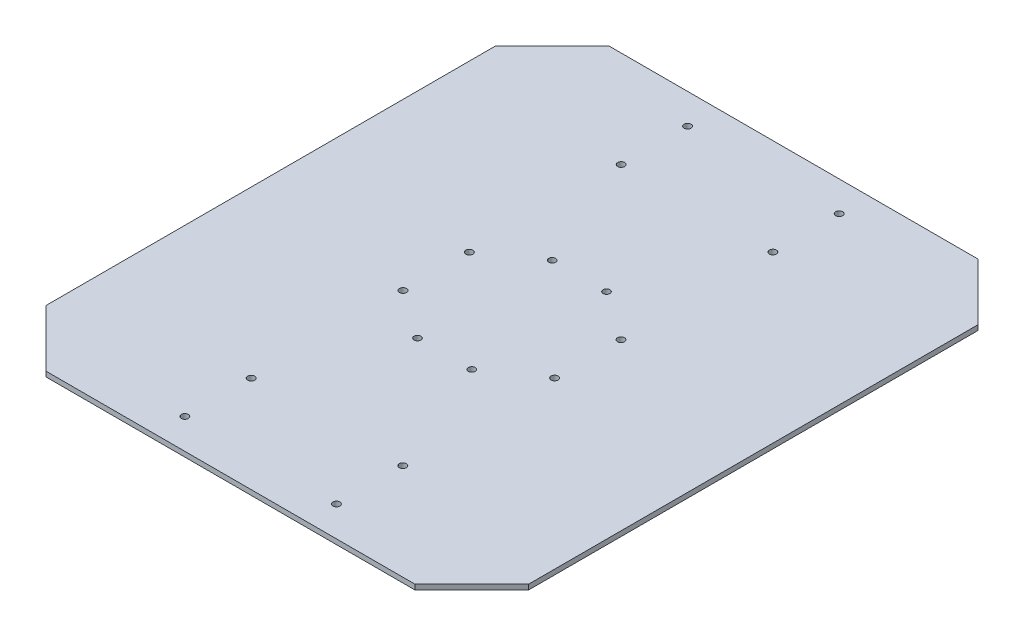
ISO-10303-21;
HEADER;
FILE_DESCRIPTION(('STEP AP214'),'2;1');
FILE_NAME('part.step','',(''),(''),'','','');
FILE_SCHEMA(('AUTOMOTIVE_DESIGN { 1 0 10303 214 1 1 1 1 }'));
ENDSEC;
DATA;
#1=APPLICATION_CONTEXT('core data for automotive mechanical design processes');
#2=APPLICATION_PROTOCOL_DEFINITION('international standard','automotive_design',2000,#1);
#3=PRODUCT_CONTEXT('',#1,'mechanical');
#4=PRODUCT('Part','Part','',(#3));
#5=PRODUCT_RELATED_PRODUCT_CATEGORY('part','',(#4));
#6=PRODUCT_DEFINITION_FORMATION('','',#4);
#7=PRODUCT_DEFINITION_CONTEXT('part definition',#1,'design');
#8=PRODUCT_DEFINITION('design','',#6,#7);
#9=PRODUCT_DEFINITION_SHAPE('','',#8);
#10=(LENGTH_UNIT() NAMED_UNIT(*) SI_UNIT(.MILLI.,.METRE.));
#11=(NAMED_UNIT(*) PLANE_ANGLE_UNIT() SI_UNIT($,.RADIAN.));
#12=(NAMED_UNIT(*) SI_UNIT($,.STERADIAN.) SOLID_ANGLE_UNIT());
#13=UNCERTAINTY_MEASURE_WITH_UNIT(LENGTH_MEASURE(1.E-05),#10,'distance_accuracy_value','');
#14=(GEOMETRIC_REPRESENTATION_CONTEXT(3) GLOBAL_UNCERTAINTY_ASSIGNED_CONTEXT((#13)) GLOBAL_UNIT_ASSIGNED_CONTEXT((#10,
#11,#12)) REPRESENTATION_CONTEXT('',''));
#15=CARTESIAN_POINT('',(0.,0.,0.));
#16=DIRECTION('',(0.,0.,1.));
#17=DIRECTION('',(1.,0.,0.));
#18=AXIS2_PLACEMENT_3D('',#15,#16,#17);
#19=CARTESIAN_POINT('',(-121.286052627379,3.175,0.));
#20=DIRECTION('',(1.,0.,0.));
#21=DIRECTION('',(0.,0.,-1.));
#22=AXIS2_PLACEMENT_3D('',#19,#20,#21);
#23=PLANE('',#22);
#24=DIRECTION('',(0.,0.,1.));
#25=VECTOR('',#24,1.);
#26=CARTESIAN_POINT('',(-121.286052627379,0.,0.));
#27=LINE('',#26,#25);
#28=CARTESIAN_POINT('',(-121.286052627379,0.,-87.1379524641618));
#29=VERTEX_POINT('',#28);
#30=CARTESIAN_POINT('',(-121.286052627379,0.,196.619998567285));
#31=VERTEX_POINT('',#30);
#32=EDGE_CURVE('E171',#29,#31,#27,.T.);
#33=ORIENTED_EDGE('',*,*,#32,.T.);
#34=DIRECTION('',(0.,-1.,0.));
#35=VECTOR('',#34,1.);
#36=CARTESIAN_POINT('',(-121.286052627379,3.175,196.619998567285));
#37=LINE('',#36,#35);
#38=CARTESIAN_POINT('',(-121.286052627379,3.175,196.619998567285));
#39=VERTEX_POINT('',#38);
#40=EDGE_CURVE('E11',#39,#31,#37,.T.);
#41=ORIENTED_EDGE('',*,*,#40,.F.);
#42=DIRECTION('',(0.,0.,1.));
#43=VECTOR('',#42,1.);
#44=CARTESIAN_POINT('',(-121.286052627379,3.175,0.));
#45=LINE('',#44,#43);
#46=CARTESIAN_POINT('',(-121.286052627379,3.175,-87.1379524641618));
#47=VERTEX_POINT('',#46);
#48=EDGE_CURVE('E229',#47,#39,#45,.T.);
#49=ORIENTED_EDGE('',*,*,#48,.F.);
#50=DIRECTION('',(0.,-1.,0.));
#51=VECTOR('',#50,1.);
#52=CARTESIAN_POINT('',(-121.286052627379,3.175,-87.1379524641618));
#53=LINE('',#52,#51);
#54=EDGE_CURVE('E52',#47,#29,#53,.T.);
#55=ORIENTED_EDGE('',*,*,#54,.T.);
#56=EDGE_LOOP('',(#33,#41,#49,#55));
#57=FACE_BOUND('',#56,.T.);
#58=ADVANCED_FACE('F35',(#57),#23,.F.);
#59=CARTESIAN_POINT('',(-158.953025597332,3.175,158.953025597332));
#60=DIRECTION('',(0.707106781186549,0.,-0.707106781186546));
#61=DIRECTION('',(-0.707106781186546,0.,-0.707106781186549));
#62=AXIS2_PLACEMENT_3D('',#59,#60,#61);
#63=PLANE('',#62);
#64=DIRECTION('',(0.707106781186546,0.,0.707106781186549));
#65=VECTOR('',#64,1.);
#66=CARTESIAN_POINT('',(-158.953025597332,0.,158.953025597332));
#67=LINE('',#66,#65);
#68=CARTESIAN_POINT('',(-85.3650281431029,0.,232.541023051561));
#69=VERTEX_POINT('',#68);
#70=EDGE_CURVE('E173',#31,#69,#67,.T.);
#71=ORIENTED_EDGE('',*,*,#70,.T.);
#72=DIRECTION('',(0.,-1.,0.));
#73=VECTOR('',#72,1.);
#74=CARTESIAN_POINT('',(-85.3650281431029,3.175,232.541023051561));
#75=LINE('',#74,#73);
#76=CARTESIAN_POINT('',(-85.3650281431029,3.175,232.541023051561));
#77=VERTEX_POINT('',#76);
#78=EDGE_CURVE('E44',#77,#69,#75,.T.);
#79=ORIENTED_EDGE('',*,*,#78,.F.);
#80=DIRECTION('',(0.707106781186546,0.,0.707106781186549));
#81=VECTOR('',#80,1.);
#82=CARTESIAN_POINT('',(-158.953025597332,3.175,158.953025597332));
#83=LINE('',#82,#81);
#84=EDGE_CURVE('E90',#39,#77,#83,.T.);
#85=ORIENTED_EDGE('',*,*,#84,.F.);
#86=ORIENTED_EDGE('',*,*,#40,.T.);
#87=EDGE_LOOP('',(#71,#79,#85,#86));
#88=FACE_BOUND('',#87,.T.);
#89=ADVANCED_FACE('F332',(#88),#63,.F.);
#90=CARTESIAN_POINT('',(0.,3.175,232.541023051561));
#91=DIRECTION('',(0.,0.,-1.));
#92=DIRECTION('',(-1.,0.,0.));
#93=AXIS2_PLACEMENT_3D('',#90,#91,#92);
#94=PLANE('',#93);
#95=DIRECTION('',(1.,0.,0.));
#96=VECTOR('',#95,1.);
#97=CARTESIAN_POINT('',(0.,0.,232.541023051561));
#98=LINE('',#97,#96);
#99=CARTESIAN_POINT('',(147.592922888344,0.,232.541023051561));
#100=VERTEX_POINT('',#99);
#101=EDGE_CURVE('E175',#69,#100,#98,.T.);
#102=ORIENTED_EDGE('',*,*,#101,.T.);
#103=DIRECTION('',(0.,-1.,0.));
#104=VECTOR('',#103,1.);
#105=CARTESIAN_POINT('',(147.592922888344,3.175,232.541023051561));
#106=LINE('',#105,#104);
#107=CARTESIAN_POINT('',(147.592922888344,3.175,232.541023051561));
#108=VERTEX_POINT('',#107);
#109=EDGE_CURVE('E208',#108,#100,#106,.T.);
#110=ORIENTED_EDGE('',*,*,#109,.F.);
#111=DIRECTION('',(1.,0.,0.));
#112=VECTOR('',#111,1.);
#113=CARTESIAN_POINT('',(0.,3.175,232.541023051561));
#114=LINE('',#113,#112);
#115=EDGE_CURVE('E215',#77,#108,#114,.T.);
#116=ORIENTED_EDGE('',*,*,#115,.F.);
#117=ORIENTED_EDGE('',*,*,#78,.T.);
#118=EDGE_LOOP('',(#102,#110,#116,#117));
#119=FACE_BOUND('',#118,.T.);
#120=ADVANCED_FACE('F213',(#119),#94,.F.);
#121=CARTESIAN_POINT('',(190.066972969953,3.175,190.066972969952));
#122=DIRECTION('',(0.707106781186549,0.,0.707106781186546));
#123=DIRECTION('',(0.707106781186546,0.,-0.707106781186549));
#124=AXIS2_PLACEMENT_3D('',#121,#122,#123);
#125=PLANE('',#124);
#126=DIRECTION('',(-0.707106781186546,0.,0.707106781186549));
#127=VECTOR('',#126,1.);
#128=CARTESIAN_POINT('',(190.066972969953,0.,190.066972969952));
#129=LINE('',#128,#127);
#130=CARTESIAN_POINT('',(183.513947372621,0.,196.619998567285));
#131=VERTEX_POINT('',#130);
#132=EDGE_CURVE('E178',#131,#100,#129,.T.);
#133=ORIENTED_EDGE('',*,*,#132,.F.);
#134=DIRECTION('',(0.,-1.,0.));
#135=VECTOR('',#134,1.);
#136=CARTESIAN_POINT('',(183.513947372621,3.175,196.619998567285));
#137=LINE('',#136,#135);
#138=CARTESIAN_POINT('',(183.513947372621,3.175,196.619998567285));
#139=VERTEX_POINT('',#138);
#140=EDGE_CURVE('E206',#139,#131,#137,.T.);
#141=ORIENTED_EDGE('',*,*,#140,.F.);
#142=DIRECTION('',(-0.707106781186546,0.,0.707106781186549));
#143=VECTOR('',#142,1.);
#144=CARTESIAN_POINT('',(190.066972969953,3.175,190.066972969952));
#145=LINE('',#144,#143);
#146=EDGE_CURVE('E224',#139,#108,#145,.T.);
#147=ORIENTED_EDGE('',*,*,#146,.T.);
#148=ORIENTED_EDGE('',*,*,#109,.T.);
#149=EDGE_LOOP('',(#133,#141,#147,#148));
#150=FACE_BOUND('',#149,.T.);
#151=ADVANCED_FACE('F222',(#150),#125,.T.);
#152=CARTESIAN_POINT('',(183.513947372621,3.175,0.));
#153=DIRECTION('',(1.,0.,0.));
#154=DIRECTION('',(0.,0.,-1.));
#155=AXIS2_PLACEMENT_3D('',#152,#153,#154);
#156=PLANE('',#155);
#157=DIRECTION('',(0.,0.,1.));
#158=VECTOR('',#157,1.);
#159=CARTESIAN_POINT('',(183.513947372621,0.,0.));
#160=LINE('',#159,#158);
#161=CARTESIAN_POINT('',(183.513947372621,0.,-87.137952464162));
#162=VERTEX_POINT('',#161);
#163=EDGE_CURVE('E181',#162,#131,#160,.T.);
#164=ORIENTED_EDGE('',*,*,#163,.F.);
#165=DIRECTION('',(0.,-1.,0.));
#166=VECTOR('',#165,1.);
#167=CARTESIAN_POINT('',(183.513947372621,3.175,-87.137952464162));
#168=LINE('',#167,#166);
#169=CARTESIAN_POINT('',(183.513947372621,3.175,-87.137952464162));
#170=VERTEX_POINT('',#169);
#171=EDGE_CURVE('E126',#170,#162,#168,.T.);
#172=ORIENTED_EDGE('',*,*,#171,.F.);
#173=DIRECTION('',(0.,0.,1.));
#174=VECTOR('',#173,1.);
#175=CARTESIAN_POINT('',(183.513947372621,3.175,0.));
#176=LINE('',#175,#174);
#177=EDGE_CURVE('E116',#170,#139,#176,.T.);
#178=ORIENTED_EDGE('',*,*,#177,.T.);
#179=ORIENTED_EDGE('',*,*,#140,.T.);
#180=EDGE_LOOP('',(#164,#172,#178,#179));
#181=FACE_BOUND('',#180,.T.);
#182=ADVANCED_FACE('F413',(#181),#156,.T.);
#183=CARTESIAN_POINT('',(135.325949918392,3.175,-135.325949918391));
#184=DIRECTION('',(-0.707106781186549,0.,0.707106781186546));
#185=DIRECTION('',(0.707106781186546,0.,0.707106781186549));
#186=AXIS2_PLACEMENT_3D('',#183,#184,#185);
#187=PLANE('',#186);
#188=DIRECTION('',(-0.707106781186546,0.,-0.707106781186549));
#189=VECTOR('',#188,1.);
#190=CARTESIAN_POINT('',(135.325949918392,0.,-135.325949918391));
#191=LINE('',#190,#189);
#192=CARTESIAN_POINT('',(147.592922888344,0.,-123.058976948439));
#193=VERTEX_POINT('',#192);
#194=EDGE_CURVE('E123',#162,#193,#191,.T.);
#195=ORIENTED_EDGE('',*,*,#194,.T.);
#196=DIRECTION('',(0.,-1.,0.));
#197=VECTOR('',#196,1.);
#198=CARTESIAN_POINT('',(147.592922888344,3.175,-123.058976948439));
#199=LINE('',#198,#197);
#200=CARTESIAN_POINT('',(147.592922888344,3.175,-123.058976948439));
#201=VERTEX_POINT('',#200);
#202=EDGE_CURVE('E120',#201,#193,#199,.T.);
#203=ORIENTED_EDGE('',*,*,#202,.F.);
#204=DIRECTION('',(-0.707106781186546,0.,-0.707106781186549));
#205=VECTOR('',#204,1.);
#206=CARTESIAN_POINT('',(135.325949918392,3.175,-135.325949918391));
#207=LINE('',#206,#205);
#208=EDGE_CURVE('E107',#170,#201,#207,.T.);
#209=ORIENTED_EDGE('',*,*,#208,.F.);
#210=ORIENTED_EDGE('',*,*,#171,.T.);
#211=EDGE_LOOP('',(#195,#203,#209,#210));
#212=FACE_BOUND('',#211,.T.);
#213=ADVANCED_FACE('F121',(#212),#187,.F.);
#214=CARTESIAN_POINT('',(0.,3.175,-123.058976948439));
#215=DIRECTION('',(0.,0.,-1.));
#216=DIRECTION('',(-1.,0.,0.));
#217=AXIS2_PLACEMENT_3D('',#214,#215,#216);
#218=PLANE('',#217);
#219=DIRECTION('',(1.,0.,0.));
#220=VECTOR('',#219,1.);
#221=CARTESIAN_POINT('',(0.,0.,-123.058976948439));
#222=LINE('',#221,#220);
#223=CARTESIAN_POINT('',(-85.3650281431029,0.,-123.058976948438));
#224=VERTEX_POINT('',#223);
#225=EDGE_CURVE('E185',#224,#193,#222,.T.);
#226=ORIENTED_EDGE('',*,*,#225,.F.);
#227=DIRECTION('',(0.,-1.,0.));
#228=VECTOR('',#227,1.);
#229=CARTESIAN_POINT('',(-85.3650281431029,3.175,-123.058976948438));
#230=LINE('',#229,#228);
#231=CARTESIAN_POINT('',(-85.3650281431029,3.175,-123.058976948438));
#232=VERTEX_POINT('',#231);
#233=EDGE_CURVE('E78',#232,#224,#230,.T.);
#234=ORIENTED_EDGE('',*,*,#233,.F.);
#235=DIRECTION('',(1.,0.,0.));
#236=VECTOR('',#235,1.);
#237=CARTESIAN_POINT('',(0.,3.175,-123.058976948439));
#238=LINE('',#237,#236);
#239=EDGE_CURVE('E113',#232,#201,#238,.T.);
#240=ORIENTED_EDGE('',*,*,#239,.T.);
#241=ORIENTED_EDGE('',*,*,#202,.T.);
#242=EDGE_LOOP('',(#226,#234,#240,#241));
#243=FACE_BOUND('',#242,.T.);
#244=ADVANCED_FACE('F128',(#243),#218,.T.);
#245=CARTESIAN_POINT('',(78.9929473726207,3.175,33.7860230515615));
#246=DIRECTION('',(0.,-1.,0.));
#247=DIRECTION('',(0.,0.,-1.));
#248=AXIS2_PLACEMENT_3D('',#245,#246,#247);
#249=CYLINDRICAL_SURFACE('',#248,2.2225);
#250=CARTESIAN_POINT('',(78.9929473726207,3.175,33.7860230515615));
#251=DIRECTION('',(0.,1.,0.));
#252=DIRECTION('',(0.,0.,1.));
#253=AXIS2_PLACEMENT_3D('',#250,#251,#252);
#254=CIRCLE('',#253,2.2225);
#255=CARTESIAN_POINT('',(78.9929473726207,3.175,36.0085230515615));
#256=VERTEX_POINT('',#255);
#257=EDGE_CURVE('E140',#256,#256,#254,.F.);
#258=ORIENTED_EDGE('',*,*,#257,.F.);
#259=EDGE_LOOP('',(#258));
#260=FACE_BOUND('',#259,.T.);
#261=CARTESIAN_POINT('',(78.9929473726207,0.,33.7860230515615));
#262=DIRECTION('',(0.,1.,0.));
#263=DIRECTION('',(0.,0.,1.));
#264=AXIS2_PLACEMENT_3D('',#261,#262,#263);
#265=CIRCLE('',#264,2.2225);
#266=CARTESIAN_POINT('',(78.9929473726207,0.,36.0085230515615));
#267=VERTEX_POINT('',#266);
#268=EDGE_CURVE('E196',#267,#267,#265,.F.);
#269=ORIENTED_EDGE('',*,*,#268,.T.);
#270=EDGE_LOOP('',(#269));
#271=FACE_BOUND('',#270,.T.);
#272=ADVANCED_FACE('F395',(#260,#271),#249,.F.);
#273=CARTESIAN_POINT('',(-16.7650526273794,3.175,213.491023051561));
#274=DIRECTION('',(0.,-1.,0.));
#275=DIRECTION('',(0.,0.,-1.));
#276=AXIS2_PLACEMENT_3D('',#273,#274,#275);
#277=CYLINDRICAL_SURFACE('',#276,2.22250000000002);
#278=CARTESIAN_POINT('',(-16.7650526273794,3.175,213.491023051561));
#279=DIRECTION('',(0.,1.,0.));
#280=DIRECTION('',(0.,0.,1.));
#281=AXIS2_PLACEMENT_3D('',#278,#279,#280);
#282=CIRCLE('',#281,2.22250000000002);
#283=CARTESIAN_POINT('',(-16.7650526273794,3.175,215.713523051562));
#284=VERTEX_POINT('',#283);
#285=EDGE_CURVE('E137',#284,#284,#282,.F.);
#286=ORIENTED_EDGE('',*,*,#285,.F.);
#287=EDGE_LOOP('',(#286));
#288=FACE_BOUND('',#287,.T.);
#289=CARTESIAN_POINT('',(-16.7650526273794,0.,213.491023051561));
#290=DIRECTION('',(0.,1.,0.));
#291=DIRECTION('',(0.,0.,1.));
#292=AXIS2_PLACEMENT_3D('',#289,#290,#291);
#293=CIRCLE('',#292,2.22250000000002);
#294=CARTESIAN_POINT('',(-16.7650526273794,0.,215.713523051562));
#295=VERTEX_POINT('',#294);
#296=EDGE_CURVE('E193',#295,#295,#293,.F.);
#297=ORIENTED_EDGE('',*,*,#296,.T.);
#298=EDGE_LOOP('',(#297));
#299=FACE_BOUND('',#298,.T.);
#300=ADVANCED_FACE('F398',(#288,#299),#277,.F.);
#301=CARTESIAN_POINT('',(78.9929473726206,3.175,171.581023051561));
#302=DIRECTION('',(0.,-1.,0.));
#303=DIRECTION('',(0.,0.,-1.));
#304=AXIS2_PLACEMENT_3D('',#301,#302,#303);
#305=CYLINDRICAL_SURFACE('',#304,2.2225);
#306=CARTESIAN_POINT('',(78.9929473726206,3.175,171.581023051561));
#307=DIRECTION('',(0.,1.,0.));
#308=DIRECTION('',(0.,0.,1.));
#309=AXIS2_PLACEMENT_3D('',#306,#307,#308);
#310=CIRCLE('',#309,2.2225);
#311=CARTESIAN_POINT('',(78.9929473726206,3.175,173.803523051561));
#312=VERTEX_POINT('',#311);
#313=EDGE_CURVE('E131',#312,#312,#310,.F.);
#314=ORIENTED_EDGE('',*,*,#313,.F.);
#315=EDGE_LOOP('',(#314));
#316=FACE_BOUND('',#315,.T.);
#317=CARTESIAN_POINT('',(78.9929473726206,0.,171.581023051561));
#318=DIRECTION('',(0.,1.,0.));
#319=DIRECTION('',(0.,0.,1.));
#320=AXIS2_PLACEMENT_3D('',#317,#318,#319);
#321=CIRCLE('',#320,2.2225);
#322=CARTESIAN_POINT('',(78.9929473726206,0.,173.803523051561));
#323=VERTEX_POINT('',#322);
#324=EDGE_CURVE('E190',#323,#323,#321,.F.);
#325=ORIENTED_EDGE('',*,*,#324,.T.);
#326=EDGE_LOOP('',(#325));
#327=FACE_BOUND('',#326,.T.);
#328=ADVANCED_FACE('F402',(#316,#327),#305,.F.);
#329=CARTESIAN_POINT('',(-104.212002545771,3.175,-104.21200254577));
#330=DIRECTION('',(-0.707106781186549,0.,-0.707106781186546));
#331=DIRECTION('',(-0.707106781186546,0.,0.707106781186549));
#332=AXIS2_PLACEMENT_3D('',#329,#330,#331);
#333=PLANE('',#332);
#334=DIRECTION('',(0.707106781186546,0.,-0.707106781186549));
#335=VECTOR('',#334,1.);
#336=CARTESIAN_POINT('',(-104.212002545771,0.,-104.21200254577));
#337=LINE('',#336,#335);
#338=EDGE_CURVE('E187',#29,#224,#337,.T.);
#339=ORIENTED_EDGE('',*,*,#338,.F.);
#340=ORIENTED_EDGE('',*,*,#54,.F.);
#341=DIRECTION('',(0.707106781186546,0.,-0.707106781186549));
#342=VECTOR('',#341,1.);
#343=CARTESIAN_POINT('',(-104.212002545771,3.175,-104.21200254577));
#344=LINE('',#343,#342);
#345=EDGE_CURVE('E129',#47,#232,#344,.T.);
#346=ORIENTED_EDGE('',*,*,#345,.T.);
#347=ORIENTED_EDGE('',*,*,#233,.T.);
#348=EDGE_LOOP('',(#339,#340,#346,#347));
#349=FACE_BOUND('',#348,.T.);
#350=ADVANCED_FACE('F317',(#349),#333,.T.);
#351=CARTESIAN_POINT('',(-16.7650526273794,3.175,-104.008976948439));
#352=DIRECTION('',(0.,-1.,0.));
#353=DIRECTION('',(0.,0.,-1.));
#354=AXIS2_PLACEMENT_3D('',#351,#352,#353);
#355=CYLINDRICAL_SURFACE('',#354,2.2225);
#356=CARTESIAN_POINT('',(-16.7650526273794,3.175,-104.008976948439));
#357=DIRECTION('',(0.,1.,0.));
#358=DIRECTION('',(0.,0.,1.));
#359=AXIS2_PLACEMENT_3D('',#356,#357,#358);
#360=CIRCLE('',#359,2.2225);
#361=CARTESIAN_POINT('',(-16.7650526273794,3.175,-101.786476948439));
#362=VERTEX_POINT('',#361);
#363=EDGE_CURVE('E231',#362,#362,#360,.T.);
#364=ORIENTED_EDGE('',*,*,#363,.T.);
#365=EDGE_LOOP('',(#364));
#366=FACE_BOUND('',#365,.T.);
#367=CARTESIAN_POINT('',(-16.7650526273794,0.,-104.008976948439));
#368=DIRECTION('',(0.,1.,0.));
#369=DIRECTION('',(0.,0.,1.));
#370=AXIS2_PLACEMENT_3D('',#367,#368,#369);
#371=CIRCLE('',#370,2.2225);
#372=CARTESIAN_POINT('',(-16.7650526273794,0.,-101.786476948439));
#373=VERTEX_POINT('',#372);
#374=EDGE_CURVE('E168',#373,#373,#371,.T.);
#375=ORIENTED_EDGE('',*,*,#374,.F.);
#376=EDGE_LOOP('',(#375));
#377=FACE_BOUND('',#376,.T.);
#378=ADVANCED_FACE('F313',(#366,#377),#355,.F.);
#379=CARTESIAN_POINT('',(78.9929473726206,3.175,-104.008976948439));
#380=DIRECTION('',(0.,-1.,0.));
#381=DIRECTION('',(0.,0.,-1.));
#382=AXIS2_PLACEMENT_3D('',#379,#380,#381);
#383=CYLINDRICAL_SURFACE('',#382,2.2225);
#384=CARTESIAN_POINT('',(78.9929473726206,3.175,-104.008976948439));
#385=DIRECTION('',(0.,1.,0.));
#386=DIRECTION('',(0.,0.,1.));
#387=AXIS2_PLACEMENT_3D('',#384,#385,#386);
#388=CIRCLE('',#387,2.2225);
#389=CARTESIAN_POINT('',(78.9929473726206,3.175,-101.786476948439));
#390=VERTEX_POINT('',#389);
#391=EDGE_CURVE('E234',#390,#390,#388,.T.);
#392=ORIENTED_EDGE('',*,*,#391,.T.);
#393=EDGE_LOOP('',(#392));
#394=FACE_BOUND('',#393,.T.);
#395=CARTESIAN_POINT('',(78.9929473726206,0.,-104.008976948439));
#396=DIRECTION('',(0.,1.,0.));
#397=DIRECTION('',(0.,0.,1.));
#398=AXIS2_PLACEMENT_3D('',#395,#396,#397);
#399=CIRCLE('',#398,2.2225);
#400=CARTESIAN_POINT('',(78.9929473726206,0.,-101.786476948439));
#401=VERTEX_POINT('',#400);
#402=EDGE_CURVE('E165',#401,#401,#399,.T.);
#403=ORIENTED_EDGE('',*,*,#402,.F.);
#404=EDGE_LOOP('',(#403));
#405=FACE_BOUND('',#404,.T.);
#406=ADVANCED_FACE('F316',(#394,#405),#383,.F.);
#407=CARTESIAN_POINT('',(-16.7650526273793,3.175,-62.0989769484385));
#408=DIRECTION('',(0.,-1.,0.));
#409=DIRECTION('',(0.,0.,-1.));
#410=AXIS2_PLACEMENT_3D('',#407,#408,#409);
#411=CYLINDRICAL_SURFACE('',#410,2.22250000000001);
#412=CARTESIAN_POINT('',(-16.7650526273793,3.175,-62.0989769484385));
#413=DIRECTION('',(0.,1.,0.));
#414=DIRECTION('',(0.,0.,1.));
#415=AXIS2_PLACEMENT_3D('',#412,#413,#414);
#416=CIRCLE('',#415,2.22250000000001);
#417=CARTESIAN_POINT('',(-16.7650526273793,3.175,-59.8764769484385));
#418=VERTEX_POINT('',#417);
#419=EDGE_CURVE('E237',#418,#418,#416,.T.);
#420=ORIENTED_EDGE('',*,*,#419,.T.);
#421=EDGE_LOOP('',(#420));
#422=FACE_BOUND('',#421,.T.);
#423=CARTESIAN_POINT('',(-16.7650526273793,0.,-62.0989769484385));
#424=DIRECTION('',(0.,1.,0.));
#425=DIRECTION('',(0.,0.,1.));
#426=AXIS2_PLACEMENT_3D('',#423,#424,#425);
#427=CIRCLE('',#426,2.22250000000001);
#428=CARTESIAN_POINT('',(-16.7650526273793,0.,-59.8764769484385));
#429=VERTEX_POINT('',#428);
#430=EDGE_CURVE('E162',#429,#429,#427,.T.);
#431=ORIENTED_EDGE('',*,*,#430,.F.);
#432=EDGE_LOOP('',(#431));
#433=FACE_BOUND('',#432,.T.);
#434=ADVANCED_FACE('F342',(#422,#433),#411,.F.);
#435=CARTESIAN_POINT('',(78.9929473726206,3.175,-62.0989769484385));
#436=DIRECTION('',(0.,-1.,0.));
#437=DIRECTION('',(0.,0.,-1.));
#438=AXIS2_PLACEMENT_3D('',#435,#436,#437);
#439=CYLINDRICAL_SURFACE('',#438,2.2225);
#440=CARTESIAN_POINT('',(78.9929473726206,3.175,-62.0989769484385));
#441=DIRECTION('',(0.,1.,0.));
#442=DIRECTION('',(0.,0.,1.));
#443=AXIS2_PLACEMENT_3D('',#440,#441,#442);
#444=CIRCLE('',#443,2.2225);
#445=CARTESIAN_POINT('',(78.9929473726206,3.175,-59.8764769484385));
#446=VERTEX_POINT('',#445);
#447=EDGE_CURVE('E240',#446,#446,#444,.T.);
#448=ORIENTED_EDGE('',*,*,#447,.T.);
#449=EDGE_LOOP('',(#448));
#450=FACE_BOUND('',#449,.T.);
#451=CARTESIAN_POINT('',(78.9929473726206,0.,-62.0989769484385));
#452=DIRECTION('',(0.,1.,0.));
#453=DIRECTION('',(0.,0.,1.));
#454=AXIS2_PLACEMENT_3D('',#451,#452,#453);
#455=CIRCLE('',#454,2.2225);
#456=CARTESIAN_POINT('',(78.9929473726206,0.,-59.8764769484385));
#457=VERTEX_POINT('',#456);
#458=EDGE_CURVE('E159',#457,#457,#455,.T.);
#459=ORIENTED_EDGE('',*,*,#458,.F.);
#460=EDGE_LOOP('',(#459));
#461=FACE_BOUND('',#460,.T.);
#462=ADVANCED_FACE('F346',(#450,#461),#439,.F.);
#463=CARTESIAN_POINT('',(-16.7650526273793,3.175,171.581023051561));
#464=DIRECTION('',(0.,-1.,0.));
#465=DIRECTION('',(0.,0.,-1.));
#466=AXIS2_PLACEMENT_3D('',#463,#464,#465);
#467=CYLINDRICAL_SURFACE('',#466,2.22249999999999);
#468=CARTESIAN_POINT('',(-16.7650526273793,3.175,171.581023051561));
#469=DIRECTION('',(0.,1.,0.));
#470=DIRECTION('',(0.,0.,1.));
#471=AXIS2_PLACEMENT_3D('',#468,#469,#470);
#472=CIRCLE('',#471,2.22249999999999);
#473=CARTESIAN_POINT('',(-16.7650526273793,3.175,173.803523051561));
#474=VERTEX_POINT('',#473);
#475=EDGE_CURVE('E243',#474,#474,#472,.F.);
#476=ORIENTED_EDGE('',*,*,#475,.F.);
#477=EDGE_LOOP('',(#476));
#478=FACE_BOUND('',#477,.T.);
#479=CARTESIAN_POINT('',(-16.7650526273793,0.,171.581023051561));
#480=DIRECTION('',(0.,1.,0.));
#481=DIRECTION('',(0.,0.,1.));
#482=AXIS2_PLACEMENT_3D('',#479,#480,#481);
#483=CIRCLE('',#482,2.22249999999999);
#484=CARTESIAN_POINT('',(-16.7650526273793,0.,173.803523051561));
#485=VERTEX_POINT('',#484);
#486=EDGE_CURVE('E156',#485,#485,#483,.F.);
#487=ORIENTED_EDGE('',*,*,#486,.T.);
#488=EDGE_LOOP('',(#487));
#489=FACE_BOUND('',#488,.T.);
#490=ADVANCED_FACE('F350',(#478,#489),#467,.F.);
#491=CARTESIAN_POINT('',(78.9929473726206,3.175,213.491023051561));
#492=DIRECTION('',(0.,-1.,0.));
#493=DIRECTION('',(0.,0.,-1.));
#494=AXIS2_PLACEMENT_3D('',#491,#492,#493);
#495=CYLINDRICAL_SURFACE('',#494,2.22250000000003);
#496=CARTESIAN_POINT('',(78.9929473726206,3.175,213.491023051561));
#497=DIRECTION('',(0.,1.,0.));
#498=DIRECTION('',(0.,0.,1.));
#499=AXIS2_PLACEMENT_3D('',#496,#497,#498);
#500=CIRCLE('',#499,2.22250000000003);
#501=CARTESIAN_POINT('',(78.9929473726206,3.175,215.713523051562));
#502=VERTEX_POINT('',#501);
#503=EDGE_CURVE('E246',#502,#502,#500,.F.);
#504=ORIENTED_EDGE('',*,*,#503,.F.);
#505=EDGE_LOOP('',(#504));
#506=FACE_BOUND('',#505,.T.);
#507=CARTESIAN_POINT('',(78.9929473726206,0.,213.491023051561));
#508=DIRECTION('',(0.,1.,0.));
#509=DIRECTION('',(0.,0.,1.));
#510=AXIS2_PLACEMENT_3D('',#507,#508,#509);
#511=CIRCLE('',#510,2.22250000000003);
#512=CARTESIAN_POINT('',(78.9929473726206,0.,215.713523051562));
#513=VERTEX_POINT('',#512);
#514=EDGE_CURVE('E153',#513,#513,#511,.F.);
#515=ORIENTED_EDGE('',*,*,#514,.T.);
#516=EDGE_LOOP('',(#515));
#517=FACE_BOUND('',#516,.T.);
#518=ADVANCED_FACE('F354',(#506,#517),#495,.F.);
#519=CARTESIAN_POINT('',(-16.7650526273793,3.175,33.7860230515615));
#520=DIRECTION('',(0.,-1.,0.));
#521=DIRECTION('',(0.,0.,-1.));
#522=AXIS2_PLACEMENT_3D('',#519,#520,#521);
#523=CYLINDRICAL_SURFACE('',#522,2.22250000000001);
#524=CARTESIAN_POINT('',(-16.7650526273793,3.175,33.7860230515615));
#525=DIRECTION('',(0.,1.,0.));
#526=DIRECTION('',(0.,0.,1.));
#527=AXIS2_PLACEMENT_3D('',#524,#525,#526);
#528=CIRCLE('',#527,2.22250000000001);
#529=CARTESIAN_POINT('',(-16.7650526273793,3.175,36.0085230515615));
#530=VERTEX_POINT('',#529);
#531=EDGE_CURVE('E249',#530,#530,#528,.F.);
#532=ORIENTED_EDGE('',*,*,#531,.F.);
#533=EDGE_LOOP('',(#532));
#534=FACE_BOUND('',#533,.T.);
#535=CARTESIAN_POINT('',(-16.7650526273793,0.,33.7860230515615));
#536=DIRECTION('',(0.,1.,0.));
#537=DIRECTION('',(0.,0.,1.));
#538=AXIS2_PLACEMENT_3D('',#535,#536,#537);
#539=CIRCLE('',#538,2.22250000000001);
#540=CARTESIAN_POINT('',(-16.7650526273793,0.,36.0085230515615));
#541=VERTEX_POINT('',#540);
#542=EDGE_CURVE('E149',#541,#541,#539,.F.);
#543=ORIENTED_EDGE('',*,*,#542,.T.);
#544=EDGE_LOOP('',(#543));
#545=FACE_BOUND('',#544,.T.);
#546=ADVANCED_FACE('F357',(#534,#545),#523,.F.);
#547=CARTESIAN_POINT('',(78.9929473726207,3.175,75.6960230515615));
#548=DIRECTION('',(0.,-1.,0.));
#549=DIRECTION('',(0.,0.,-1.));
#550=AXIS2_PLACEMENT_3D('',#547,#548,#549);
#551=CYLINDRICAL_SURFACE('',#550,2.22250000000001);
#552=CARTESIAN_POINT('',(78.9929473726207,3.175,75.6960230515615));
#553=DIRECTION('',(0.,1.,0.));
#554=DIRECTION('',(0.,0.,1.));
#555=AXIS2_PLACEMENT_3D('',#552,#553,#554);
#556=CIRCLE('',#555,2.22250000000001);
#557=CARTESIAN_POINT('',(78.9929473726207,3.175,77.9185230515615));
#558=VERTEX_POINT('',#557);
#559=EDGE_CURVE('E202',#558,#558,#556,.F.);
#560=ORIENTED_EDGE('',*,*,#559,.F.);
#561=EDGE_LOOP('',(#560));
#562=FACE_BOUND('',#561,.T.);
#563=CARTESIAN_POINT('',(78.9929473726207,0.,75.6960230515615));
#564=DIRECTION('',(0.,1.,0.));
#565=DIRECTION('',(0.,0.,1.));
#566=AXIS2_PLACEMENT_3D('',#563,#564,#565);
#567=CIRCLE('',#566,2.22250000000001);
#568=CARTESIAN_POINT('',(78.9929473726207,0.,77.9185230515615));
#569=VERTEX_POINT('',#568);
#570=EDGE_CURVE('E146',#569,#569,#567,.F.);
#571=ORIENTED_EDGE('',*,*,#570,.T.);
#572=EDGE_LOOP('',(#571));
#573=FACE_BOUND('',#572,.T.);
#574=ADVANCED_FACE('F37',(#562,#573),#551,.F.);
#575=CARTESIAN_POINT('',(-16.7650526273793,3.175,75.6960230515615));
#576=DIRECTION('',(0.,-1.,0.));
#577=DIRECTION('',(0.,0.,-1.));
#578=AXIS2_PLACEMENT_3D('',#575,#576,#577);
#579=CYLINDRICAL_SURFACE('',#578,2.22250000000001);
#580=CARTESIAN_POINT('',(-16.7650526273793,3.175,75.6960230515615));
#581=DIRECTION('',(0.,1.,0.));
#582=DIRECTION('',(0.,0.,1.));
#583=AXIS2_PLACEMENT_3D('',#580,#581,#582);
#584=CIRCLE('',#583,2.22250000000001);
#585=CARTESIAN_POINT('',(-16.7650526273793,3.175,77.9185230515615));
#586=VERTEX_POINT('',#585);
#587=EDGE_CURVE('E143',#586,#586,#584,.F.);
#588=ORIENTED_EDGE('',*,*,#587,.F.);
#589=EDGE_LOOP('',(#588));
#590=FACE_BOUND('',#589,.T.);
#591=CARTESIAN_POINT('',(-16.7650526273793,0.,75.6960230515615));
#592=DIRECTION('',(0.,1.,0.));
#593=DIRECTION('',(0.,0.,1.));
#594=AXIS2_PLACEMENT_3D('',#591,#592,#593);
#595=CIRCLE('',#594,2.22250000000001);
#596=CARTESIAN_POINT('',(-16.7650526273793,0.,77.9185230515615));
#597=VERTEX_POINT('',#596);
#598=EDGE_CURVE('E199',#597,#597,#595,.F.);
#599=ORIENTED_EDGE('',*,*,#598,.T.);
#600=EDGE_LOOP('',(#599));
#601=FACE_BOUND('',#600,.T.);
#602=ADVANCED_FACE('F289',(#590,#601),#579,.F.);
#603=CARTESIAN_POINT('',(0.,3.175,0.));
#604=DIRECTION('',(0.,1.,0.));
#605=DIRECTION('',(0.,0.,1.));
#606=AXIS2_PLACEMENT_3D('',#603,#604,#605);
#607=PLANE('',#606);
#608=CARTESIAN_POINT('',(48.1319473726207,3.175,12.0690230515615));
#609=DIRECTION('',(0.,1.,0.));
#610=DIRECTION('',(0.,0.,1.));
#611=AXIS2_PLACEMENT_3D('',#608,#609,#610);
#612=CIRCLE('',#611,2.15899999999999);
#613=CARTESIAN_POINT('',(48.1319473726207,3.175,14.2280230515615));
#614=VERTEX_POINT('',#613);
#615=EDGE_CURVE('E272',#614,#614,#612,.T.);
#616=ORIENTED_EDGE('',*,*,#615,.F.);
#617=EDGE_LOOP('',(#616));
#618=FACE_BOUND('',#617,.T.);
#619=CARTESIAN_POINT('',(13.8419473726207,3.175,97.1590230515615));
#620=DIRECTION('',(0.,1.,0.));
#621=DIRECTION('',(0.,0.,1.));
#622=AXIS2_PLACEMENT_3D('',#619,#620,#621);
#623=CIRCLE('',#622,2.15899999999999);
#624=CARTESIAN_POINT('',(13.8419473726207,3.175,99.3180230515615));
#625=VERTEX_POINT('',#624);
#626=EDGE_CURVE('E266',#625,#625,#623,.T.);
#627=ORIENTED_EDGE('',*,*,#626,.F.);
#628=EDGE_LOOP('',(#627));
#629=FACE_BOUND('',#628,.T.);
#630=CARTESIAN_POINT('',(48.1319473726207,3.175,97.1590230515615));
#631=DIRECTION('',(0.,1.,0.));
#632=DIRECTION('',(0.,0.,1.));
#633=AXIS2_PLACEMENT_3D('',#630,#631,#632);
#634=CIRCLE('',#633,2.15899999999999);
#635=CARTESIAN_POINT('',(48.1319473726207,3.175,99.3180230515615));
#636=VERTEX_POINT('',#635);
#637=EDGE_CURVE('E260',#636,#636,#634,.T.);
#638=ORIENTED_EDGE('',*,*,#637,.F.);
#639=EDGE_LOOP('',(#638));
#640=FACE_BOUND('',#639,.T.);
#641=CARTESIAN_POINT('',(13.8419473726207,3.175,12.0690230515615));
#642=DIRECTION('',(0.,1.,0.));
#643=DIRECTION('',(0.,0.,1.));
#644=AXIS2_PLACEMENT_3D('',#641,#642,#643);
#645=CIRCLE('',#644,2.15899999999999);
#646=CARTESIAN_POINT('',(13.8419473726207,3.175,14.2280230515615));
#647=VERTEX_POINT('',#646);
#648=EDGE_CURVE('E254',#647,#647,#645,.T.);
#649=ORIENTED_EDGE('',*,*,#648,.F.);
#650=EDGE_LOOP('',(#649));
#651=FACE_BOUND('',#650,.T.);
#652=ORIENTED_EDGE('',*,*,#559,.T.);
#653=EDGE_LOOP('',(#652));
#654=FACE_BOUND('',#653,.T.);
#655=ORIENTED_EDGE('',*,*,#531,.T.);
#656=EDGE_LOOP('',(#655));
#657=FACE_BOUND('',#656,.T.);
#658=ORIENTED_EDGE('',*,*,#503,.T.);
#659=EDGE_LOOP('',(#658));
#660=FACE_BOUND('',#659,.T.);
#661=ORIENTED_EDGE('',*,*,#475,.T.);
#662=EDGE_LOOP('',(#661));
#663=FACE_BOUND('',#662,.T.);
#664=ORIENTED_EDGE('',*,*,#447,.F.);
#665=EDGE_LOOP('',(#664));
#666=FACE_BOUND('',#665,.T.);
#667=ORIENTED_EDGE('',*,*,#419,.F.);
#668=EDGE_LOOP('',(#667));
#669=FACE_BOUND('',#668,.T.);
#670=ORIENTED_EDGE('',*,*,#391,.F.);
#671=EDGE_LOOP('',(#670));
#672=FACE_BOUND('',#671,.T.);
#673=ORIENTED_EDGE('',*,*,#363,.F.);
#674=EDGE_LOOP('',(#673));
#675=FACE_BOUND('',#674,.T.);
#676=ORIENTED_EDGE('',*,*,#48,.T.);
#677=ORIENTED_EDGE('',*,*,#84,.T.);
#678=ORIENTED_EDGE('',*,*,#115,.T.);
#679=ORIENTED_EDGE('',*,*,#146,.F.);
#680=ORIENTED_EDGE('',*,*,#177,.F.);
#681=ORIENTED_EDGE('',*,*,#208,.T.);
#682=ORIENTED_EDGE('',*,*,#239,.F.);
#683=ORIENTED_EDGE('',*,*,#345,.F.);
#684=EDGE_LOOP('',(#676,#677,#678,#679,#680,#681,#682,#683));
#685=FACE_BOUND('',#684,.T.);
#686=ORIENTED_EDGE('',*,*,#313,.T.);
#687=EDGE_LOOP('',(#686));
#688=FACE_BOUND('',#687,.T.);
#689=ORIENTED_EDGE('',*,*,#285,.T.);
#690=EDGE_LOOP('',(#689));
#691=FACE_BOUND('',#690,.T.);
#692=ORIENTED_EDGE('',*,*,#257,.T.);
#693=EDGE_LOOP('',(#692));
#694=FACE_BOUND('',#693,.T.);
#695=ORIENTED_EDGE('',*,*,#587,.T.);
#696=EDGE_LOOP('',(#695));
#697=FACE_BOUND('',#696,.T.);
#698=ADVANCED_FACE('F109',(#618,#629,#640,#651,#654,#657,#660,#663,#666,#669,#672,#675,#685,
#688,#691,#694,#697),#607,.T.);
#699=CARTESIAN_POINT('',(0.,0.,0.));
#700=DIRECTION('',(0.,1.,0.));
#701=DIRECTION('',(0.,0.,1.));
#702=AXIS2_PLACEMENT_3D('',#699,#700,#701);
#703=PLANE('',#702);
#704=CARTESIAN_POINT('',(48.1319473726207,0.,12.0690230515615));
#705=DIRECTION('',(0.,1.,0.));
#706=DIRECTION('',(0.,0.,1.));
#707=AXIS2_PLACEMENT_3D('',#704,#705,#706);
#708=CIRCLE('',#707,2.15899999999999);
#709=CARTESIAN_POINT('',(48.1319473726207,0.,14.2280230515615));
#710=VERTEX_POINT('',#709);
#711=EDGE_CURVE('E257',#710,#710,#708,.T.);
#712=ORIENTED_EDGE('',*,*,#711,.T.);
#713=EDGE_LOOP('',(#712));
#714=FACE_BOUND('',#713,.T.);
#715=CARTESIAN_POINT('',(13.8419473726207,0.,97.1590230515615));
#716=DIRECTION('',(0.,1.,0.));
#717=DIRECTION('',(0.,0.,1.));
#718=AXIS2_PLACEMENT_3D('',#715,#716,#717);
#719=CIRCLE('',#718,2.15899999999999);
#720=CARTESIAN_POINT('',(13.8419473726207,0.,99.3180230515615));
#721=VERTEX_POINT('',#720);
#722=EDGE_CURVE('E269',#721,#721,#719,.T.);
#723=ORIENTED_EDGE('',*,*,#722,.T.);
#724=EDGE_LOOP('',(#723));
#725=FACE_BOUND('',#724,.T.);
#726=CARTESIAN_POINT('',(48.1319473726207,0.,97.1590230515615));
#727=DIRECTION('',(0.,1.,0.));
#728=DIRECTION('',(0.,0.,1.));
#729=AXIS2_PLACEMENT_3D('',#726,#727,#728);
#730=CIRCLE('',#729,2.15899999999999);
#731=CARTESIAN_POINT('',(48.1319473726207,0.,99.3180230515615));
#732=VERTEX_POINT('',#731);
#733=EDGE_CURVE('E263',#732,#732,#730,.T.);
#734=ORIENTED_EDGE('',*,*,#733,.T.);
#735=EDGE_LOOP('',(#734));
#736=FACE_BOUND('',#735,.T.);
#737=CARTESIAN_POINT('',(13.8419473726207,0.,12.0690230515615));
#738=DIRECTION('',(0.,1.,0.));
#739=DIRECTION('',(0.,0.,1.));
#740=AXIS2_PLACEMENT_3D('',#737,#738,#739);
#741=CIRCLE('',#740,2.15899999999999);
#742=CARTESIAN_POINT('',(13.8419473726207,0.,14.2280230515615));
#743=VERTEX_POINT('',#742);
#744=EDGE_CURVE('E150',#743,#743,#741,.T.);
#745=ORIENTED_EDGE('',*,*,#744,.T.);
#746=EDGE_LOOP('',(#745));
#747=FACE_BOUND('',#746,.T.);
#748=ORIENTED_EDGE('',*,*,#570,.F.);
#749=EDGE_LOOP('',(#748));
#750=FACE_BOUND('',#749,.T.);
#751=ORIENTED_EDGE('',*,*,#542,.F.);
#752=EDGE_LOOP('',(#751));
#753=FACE_BOUND('',#752,.T.);
#754=ORIENTED_EDGE('',*,*,#514,.F.);
#755=EDGE_LOOP('',(#754));
#756=FACE_BOUND('',#755,.T.);
#757=ORIENTED_EDGE('',*,*,#486,.F.);
#758=EDGE_LOOP('',(#757));
#759=FACE_BOUND('',#758,.T.);
#760=ORIENTED_EDGE('',*,*,#458,.T.);
#761=EDGE_LOOP('',(#760));
#762=FACE_BOUND('',#761,.T.);
#763=ORIENTED_EDGE('',*,*,#430,.T.);
#764=EDGE_LOOP('',(#763));
#765=FACE_BOUND('',#764,.T.);
#766=ORIENTED_EDGE('',*,*,#402,.T.);
#767=EDGE_LOOP('',(#766));
#768=FACE_BOUND('',#767,.T.);
#769=ORIENTED_EDGE('',*,*,#374,.T.);
#770=EDGE_LOOP('',(#769));
#771=FACE_BOUND('',#770,.T.);
#772=ORIENTED_EDGE('',*,*,#32,.F.);
#773=ORIENTED_EDGE('',*,*,#338,.T.);
#774=ORIENTED_EDGE('',*,*,#225,.T.);
#775=ORIENTED_EDGE('',*,*,#194,.F.);
#776=ORIENTED_EDGE('',*,*,#163,.T.);
#777=ORIENTED_EDGE('',*,*,#132,.T.);
#778=ORIENTED_EDGE('',*,*,#101,.F.);
#779=ORIENTED_EDGE('',*,*,#70,.F.);
#780=EDGE_LOOP('',(#772,#773,#774,#775,#776,#777,#778,#779));
#781=FACE_BOUND('',#780,.T.);
#782=ORIENTED_EDGE('',*,*,#324,.F.);
#783=EDGE_LOOP('',(#782));
#784=FACE_BOUND('',#783,.T.);
#785=ORIENTED_EDGE('',*,*,#296,.F.);
#786=EDGE_LOOP('',(#785));
#787=FACE_BOUND('',#786,.T.);
#788=ORIENTED_EDGE('',*,*,#268,.F.);
#789=EDGE_LOOP('',(#788));
#790=FACE_BOUND('',#789,.T.);
#791=ORIENTED_EDGE('',*,*,#598,.F.);
#792=EDGE_LOOP('',(#791));
#793=FACE_BOUND('',#792,.T.);
#794=ADVANCED_FACE('F217',(#714,#725,#736,#747,#750,#753,#756,#759,#762,#765,#768,#771,#781,
#784,#787,#790,#793),#703,.F.);
#795=CARTESIAN_POINT('',(13.8419473726207,0.,12.0690230515615));
#796=DIRECTION('',(0.,1.,0.));
#797=DIRECTION('',(0.,0.,1.));
#798=AXIS2_PLACEMENT_3D('',#795,#796,#797);
#799=CYLINDRICAL_SURFACE('',#798,2.15899999999999);
#800=ORIENTED_EDGE('',*,*,#744,.F.);
#801=EDGE_LOOP('',(#800));
#802=FACE_BOUND('',#801,.T.);
#803=ORIENTED_EDGE('',*,*,#648,.T.);
#804=EDGE_LOOP('',(#803));
#805=FACE_BOUND('',#804,.T.);
#806=ADVANCED_FACE('F322',(#802,#805),#799,.F.);
#807=CARTESIAN_POINT('',(48.1319473726207,0.,97.1590230515615));
#808=DIRECTION('',(0.,1.,0.));
#809=DIRECTION('',(0.,0.,1.));
#810=AXIS2_PLACEMENT_3D('',#807,#808,#809);
#811=CYLINDRICAL_SURFACE('',#810,2.15899999999999);
#812=ORIENTED_EDGE('',*,*,#733,.F.);
#813=EDGE_LOOP('',(#812));
#814=FACE_BOUND('',#813,.T.);
#815=ORIENTED_EDGE('',*,*,#637,.T.);
#816=EDGE_LOOP('',(#815));
#817=FACE_BOUND('',#816,.T.);
#818=ADVANCED_FACE('F327',(#814,#817),#811,.F.);
#819=CARTESIAN_POINT('',(13.8419473726207,0.,97.1590230515615));
#820=DIRECTION('',(0.,1.,0.));
#821=DIRECTION('',(0.,0.,1.));
#822=AXIS2_PLACEMENT_3D('',#819,#820,#821);
#823=CYLINDRICAL_SURFACE('',#822,2.15899999999999);
#824=ORIENTED_EDGE('',*,*,#722,.F.);
#825=EDGE_LOOP('',(#824));
#826=FACE_BOUND('',#825,.T.);
#827=ORIENTED_EDGE('',*,*,#626,.T.);
#828=EDGE_LOOP('',(#827));
#829=FACE_BOUND('',#828,.T.);
#830=ADVANCED_FACE('F283',(#826,#829),#823,.F.);
#831=CARTESIAN_POINT('',(48.1319473726207,0.,12.0690230515615));
#832=DIRECTION('',(0.,1.,0.));
#833=DIRECTION('',(0.,0.,1.));
#834=AXIS2_PLACEMENT_3D('',#831,#832,#833);
#835=CYLINDRICAL_SURFACE('',#834,2.15899999999999);
#836=ORIENTED_EDGE('',*,*,#711,.F.);
#837=EDGE_LOOP('',(#836));
#838=FACE_BOUND('',#837,.T.);
#839=ORIENTED_EDGE('',*,*,#615,.T.);
#840=EDGE_LOOP('',(#839));
#841=FACE_BOUND('',#840,.T.);
#842=ADVANCED_FACE('F280',(#838,#841),#835,.F.);
#843=CLOSED_SHELL('',(#58,#89,#120,#151,#182,#213,#244,#272,#300,#328,#350,#378,#406,#434,#462,
#490,#518,#546,#574,#602,#698,#794,#806,#818,#830,#842));
#844=MANIFOLD_SOLID_BREP('B2',#843);
#845=ADVANCED_BREP_SHAPE_REPRESENTATION('',(#18,#844),#14);
#846=SHAPE_DEFINITION_REPRESENTATION(#9,#845);
ENDSEC;
END-ISO-10303-21;
